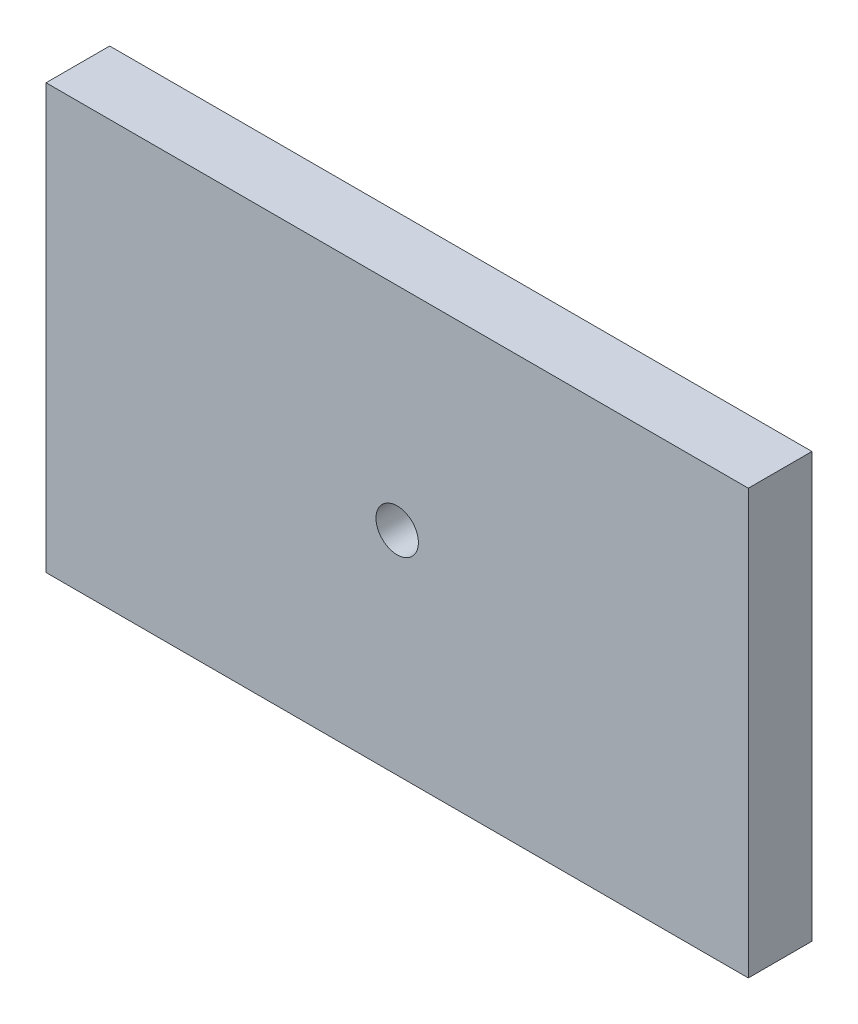
ISO-10303-21;
HEADER;
FILE_DESCRIPTION(('STEP AP214'),'2;1');
FILE_NAME('part.step','',(''),(''),'','','');
FILE_SCHEMA(('AUTOMOTIVE_DESIGN { 1 0 10303 214 1 1 1 1 }'));
ENDSEC;
DATA;
#1=APPLICATION_CONTEXT('core data for automotive mechanical design processes');
#2=APPLICATION_PROTOCOL_DEFINITION('international standard','automotive_design',2000,#1);
#3=PRODUCT_CONTEXT('',#1,'mechanical');
#4=PRODUCT('Part','Part','',(#3));
#5=PRODUCT_RELATED_PRODUCT_CATEGORY('part','',(#4));
#6=PRODUCT_DEFINITION_FORMATION('','',#4);
#7=PRODUCT_DEFINITION_CONTEXT('part definition',#1,'design');
#8=PRODUCT_DEFINITION('design','',#6,#7);
#9=PRODUCT_DEFINITION_SHAPE('','',#8);
#10=(LENGTH_UNIT() NAMED_UNIT(*) SI_UNIT(.MILLI.,.METRE.));
#11=(NAMED_UNIT(*) PLANE_ANGLE_UNIT() SI_UNIT($,.RADIAN.));
#12=(NAMED_UNIT(*) SI_UNIT($,.STERADIAN.) SOLID_ANGLE_UNIT());
#13=UNCERTAINTY_MEASURE_WITH_UNIT(LENGTH_MEASURE(1.E-05),#10,'distance_accuracy_value','');
#14=(GEOMETRIC_REPRESENTATION_CONTEXT(3) GLOBAL_UNCERTAINTY_ASSIGNED_CONTEXT((#13)) GLOBAL_UNIT_ASSIGNED_CONTEXT((#10,
#11,#12)) REPRESENTATION_CONTEXT('',''));
#15=CARTESIAN_POINT('',(0.,0.,0.));
#16=DIRECTION('',(0.,0.,1.));
#17=DIRECTION('',(1.,0.,0.));
#18=AXIS2_PLACEMENT_3D('',#15,#16,#17);
#19=CARTESIAN_POINT('',(0.,0.,3.));
#20=DIRECTION('',(0.,0.,-1.));
#21=DIRECTION('',(-1.,0.,0.));
#22=AXIS2_PLACEMENT_3D('',#19,#20,#21);
#23=PLANE('',#22);
#24=DIRECTION('',(0.,1.,0.));
#25=VECTOR('',#24,1.);
#26=CARTESIAN_POINT('',(16.555,-10.,3.));
#27=LINE('',#26,#25);
#28=CARTESIAN_POINT('',(16.555,-10.,3.));
#29=VERTEX_POINT('',#28);
#30=CARTESIAN_POINT('',(16.555,10.,3.));
#31=VERTEX_POINT('',#30);
#32=EDGE_CURVE('E84',#29,#31,#27,.T.);
#33=ORIENTED_EDGE('',*,*,#32,.T.);
#34=DIRECTION('',(-1.,0.,0.));
#35=VECTOR('',#34,1.);
#36=CARTESIAN_POINT('',(-16.555,10.,3.));
#37=LINE('',#36,#35);
#38=CARTESIAN_POINT('',(-16.555,10.,3.));
#39=VERTEX_POINT('',#38);
#40=EDGE_CURVE('E79',#31,#39,#37,.T.);
#41=ORIENTED_EDGE('',*,*,#40,.T.);
#42=DIRECTION('',(0.,-1.,0.));
#43=VECTOR('',#42,1.);
#44=CARTESIAN_POINT('',(-16.555,-10.,3.));
#45=LINE('',#44,#43);
#46=CARTESIAN_POINT('',(-16.555,-10.,3.));
#47=VERTEX_POINT('',#46);
#48=EDGE_CURVE('E82',#39,#47,#45,.T.);
#49=ORIENTED_EDGE('',*,*,#48,.T.);
#50=DIRECTION('',(1.,0.,0.));
#51=VECTOR('',#50,1.);
#52=CARTESIAN_POINT('',(-16.555,-10.,3.));
#53=LINE('',#52,#51);
#54=EDGE_CURVE('E49',#47,#29,#53,.T.);
#55=ORIENTED_EDGE('',*,*,#54,.T.);
#56=EDGE_LOOP('',(#33,#41,#49,#55));
#57=FACE_BOUND('',#56,.T.);
#58=CARTESIAN_POINT('',(0.,0.,3.));
#59=DIRECTION('',(0.,0.,1.));
#60=DIRECTION('',(1.,0.,0.));
#61=AXIS2_PLACEMENT_3D('',#58,#59,#60);
#62=CIRCLE('',#61,1.);
#63=CARTESIAN_POINT('',(1.,0.,3.));
#64=VERTEX_POINT('',#63);
#65=EDGE_CURVE('E99',#64,#64,#62,.T.);
#66=ORIENTED_EDGE('',*,*,#65,.F.);
#67=EDGE_LOOP('',(#66));
#68=FACE_BOUND('',#67,.T.);
#69=ADVANCED_FACE('F32',(#57,#68),#23,.F.);
#70=CARTESIAN_POINT('',(0.,0.,0.));
#71=DIRECTION('',(0.,0.,-1.));
#72=DIRECTION('',(-1.,0.,0.));
#73=AXIS2_PLACEMENT_3D('',#70,#71,#72);
#74=PLANE('',#73);
#75=DIRECTION('',(0.,1.,0.));
#76=VECTOR('',#75,1.);
#77=CARTESIAN_POINT('',(16.555,-10.,0.));
#78=LINE('',#77,#76);
#79=CARTESIAN_POINT('',(16.555,-10.,0.));
#80=VERTEX_POINT('',#79);
#81=CARTESIAN_POINT('',(16.555,10.,0.));
#82=VERTEX_POINT('',#81);
#83=EDGE_CURVE('E96',#80,#82,#78,.T.);
#84=ORIENTED_EDGE('',*,*,#83,.F.);
#85=DIRECTION('',(1.,0.,0.));
#86=VECTOR('',#85,1.);
#87=CARTESIAN_POINT('',(-16.555,-10.,0.));
#88=LINE('',#87,#86);
#89=CARTESIAN_POINT('',(-16.555,-10.,0.));
#90=VERTEX_POINT('',#89);
#91=EDGE_CURVE('E72',#90,#80,#88,.T.);
#92=ORIENTED_EDGE('',*,*,#91,.F.);
#93=DIRECTION('',(0.,-1.,0.));
#94=VECTOR('',#93,1.);
#95=CARTESIAN_POINT('',(-16.555,-10.,0.));
#96=LINE('',#95,#94);
#97=CARTESIAN_POINT('',(-16.555,10.,0.));
#98=VERTEX_POINT('',#97);
#99=EDGE_CURVE('E66',#98,#90,#96,.T.);
#100=ORIENTED_EDGE('',*,*,#99,.F.);
#101=DIRECTION('',(-1.,0.,0.));
#102=VECTOR('',#101,1.);
#103=CARTESIAN_POINT('',(-16.555,10.,0.));
#104=LINE('',#103,#102);
#105=EDGE_CURVE('E88',#82,#98,#104,.T.);
#106=ORIENTED_EDGE('',*,*,#105,.F.);
#107=EDGE_LOOP('',(#84,#92,#100,#106));
#108=FACE_BOUND('',#107,.T.);
#109=CARTESIAN_POINT('',(0.,0.,0.));
#110=DIRECTION('',(0.,0.,1.));
#111=DIRECTION('',(1.,0.,0.));
#112=AXIS2_PLACEMENT_3D('',#109,#110,#111);
#113=CIRCLE('',#112,1.);
#114=CARTESIAN_POINT('',(1.,0.,0.));
#115=VERTEX_POINT('',#114);
#116=EDGE_CURVE('E111',#115,#115,#113,.T.);
#117=ORIENTED_EDGE('',*,*,#116,.T.);
#118=EDGE_LOOP('',(#117));
#119=FACE_BOUND('',#118,.T.);
#120=ADVANCED_FACE('F107',(#108,#119),#74,.T.);
#121=CARTESIAN_POINT('',(16.555,-10.,3.));
#122=DIRECTION('',(-1.,0.,0.));
#123=DIRECTION('',(0.,0.,1.));
#124=AXIS2_PLACEMENT_3D('',#121,#122,#123);
#125=PLANE('',#124);
#126=ORIENTED_EDGE('',*,*,#83,.T.);
#127=DIRECTION('',(0.,0.,-1.));
#128=VECTOR('',#127,1.);
#129=CARTESIAN_POINT('',(16.555,10.,3.));
#130=LINE('',#129,#128);
#131=EDGE_CURVE('E11',#31,#82,#130,.T.);
#132=ORIENTED_EDGE('',*,*,#131,.F.);
#133=ORIENTED_EDGE('',*,*,#32,.F.);
#134=DIRECTION('',(0.,0.,-1.));
#135=VECTOR('',#134,1.);
#136=CARTESIAN_POINT('',(16.555,-10.,3.));
#137=LINE('',#136,#135);
#138=EDGE_CURVE('E92',#29,#80,#137,.T.);
#139=ORIENTED_EDGE('',*,*,#138,.T.);
#140=EDGE_LOOP('',(#126,#132,#133,#139));
#141=FACE_BOUND('',#140,.T.);
#142=ADVANCED_FACE('F34',(#141),#125,.F.);
#143=CARTESIAN_POINT('',(-16.555,10.,3.));
#144=DIRECTION('',(0.,-1.,0.));
#145=DIRECTION('',(0.,0.,-1.));
#146=AXIS2_PLACEMENT_3D('',#143,#144,#145);
#147=PLANE('',#146);
#148=ORIENTED_EDGE('',*,*,#105,.T.);
#149=DIRECTION('',(0.,0.,-1.));
#150=VECTOR('',#149,1.);
#151=CARTESIAN_POINT('',(-16.555,10.,3.));
#152=LINE('',#151,#150);
#153=EDGE_CURVE('E41',#39,#98,#152,.T.);
#154=ORIENTED_EDGE('',*,*,#153,.F.);
#155=ORIENTED_EDGE('',*,*,#40,.F.);
#156=ORIENTED_EDGE('',*,*,#131,.T.);
#157=EDGE_LOOP('',(#148,#154,#155,#156));
#158=FACE_BOUND('',#157,.T.);
#159=ADVANCED_FACE('F87',(#158),#147,.F.);
#160=CARTESIAN_POINT('',(-16.555,-10.,3.));
#161=DIRECTION('',(1.,0.,0.));
#162=DIRECTION('',(0.,0.,-1.));
#163=AXIS2_PLACEMENT_3D('',#160,#161,#162);
#164=PLANE('',#163);
#165=ORIENTED_EDGE('',*,*,#99,.T.);
#166=DIRECTION('',(0.,0.,-1.));
#167=VECTOR('',#166,1.);
#168=CARTESIAN_POINT('',(-16.555,-10.,3.));
#169=LINE('',#168,#167);
#170=EDGE_CURVE('E89',#47,#90,#169,.T.);
#171=ORIENTED_EDGE('',*,*,#170,.F.);
#172=ORIENTED_EDGE('',*,*,#48,.F.);
#173=ORIENTED_EDGE('',*,*,#153,.T.);
#174=EDGE_LOOP('',(#165,#171,#172,#173));
#175=FACE_BOUND('',#174,.T.);
#176=ADVANCED_FACE('F90',(#175),#164,.F.);
#177=CARTESIAN_POINT('',(-16.555,-10.,3.));
#178=DIRECTION('',(0.,1.,0.));
#179=DIRECTION('',(0.,0.,1.));
#180=AXIS2_PLACEMENT_3D('',#177,#178,#179);
#181=PLANE('',#180);
#182=ORIENTED_EDGE('',*,*,#91,.T.);
#183=ORIENTED_EDGE('',*,*,#138,.F.);
#184=ORIENTED_EDGE('',*,*,#54,.F.);
#185=ORIENTED_EDGE('',*,*,#170,.T.);
#186=EDGE_LOOP('',(#182,#183,#184,#185));
#187=FACE_BOUND('',#186,.T.);
#188=ADVANCED_FACE('F104',(#187),#181,.F.);
#189=CARTESIAN_POINT('',(0.,0.,3.));
#190=DIRECTION('',(0.,0.,-1.));
#191=DIRECTION('',(-1.,0.,0.));
#192=AXIS2_PLACEMENT_3D('',#189,#190,#191);
#193=CYLINDRICAL_SURFACE('',#192,1.);
#194=ORIENTED_EDGE('',*,*,#65,.T.);
#195=EDGE_LOOP('',(#194));
#196=FACE_BOUND('',#195,.T.);
#197=ORIENTED_EDGE('',*,*,#116,.F.);
#198=EDGE_LOOP('',(#197));
#199=FACE_BOUND('',#198,.T.);
#200=ADVANCED_FACE('F117',(#196,#199),#193,.F.);
#201=CLOSED_SHELL('',(#69,#120,#142,#159,#176,#188,#200));
#202=MANIFOLD_SOLID_BREP('B2',#201);
#203=ADVANCED_BREP_SHAPE_REPRESENTATION('',(#18,#202),#14);
#204=SHAPE_DEFINITION_REPRESENTATION(#9,#203);
ENDSEC;
END-ISO-10303-21;
